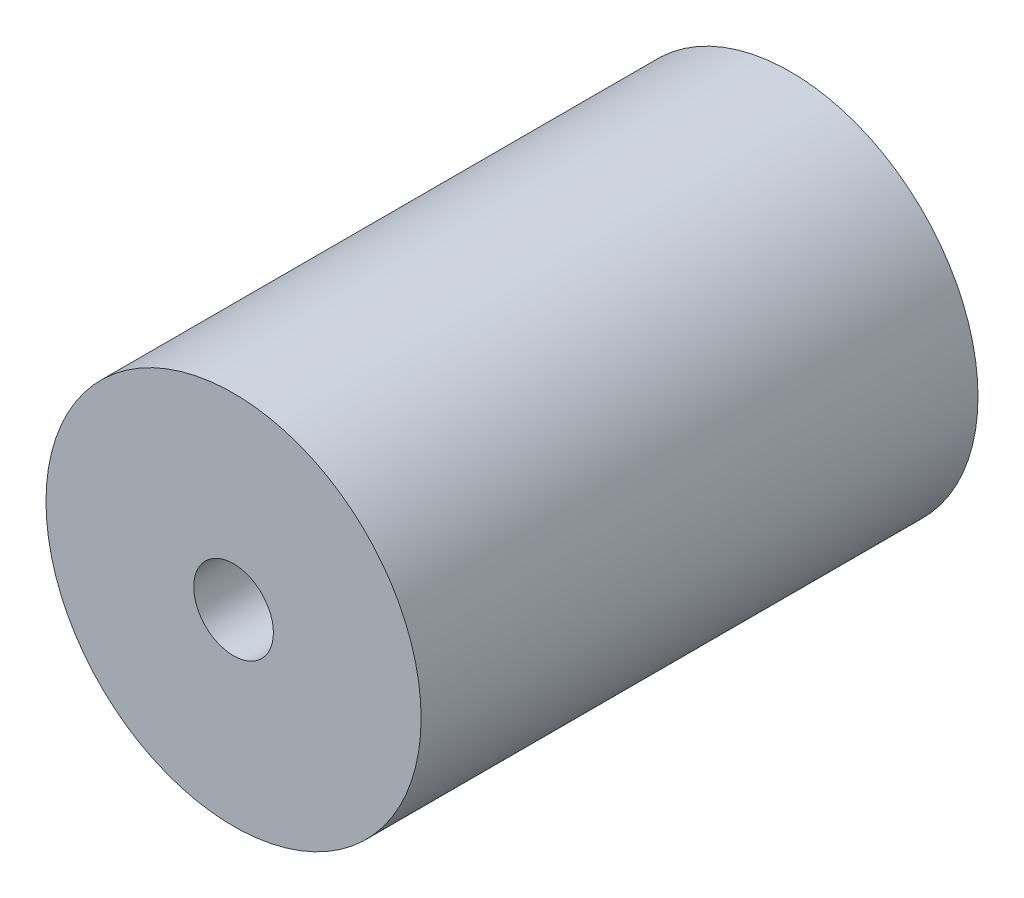
ISO-10303-21;
HEADER;
FILE_DESCRIPTION(('STEP AP214'),'2;1');
FILE_NAME('part.step','',(''),(''),'','','');
FILE_SCHEMA(('AUTOMOTIVE_DESIGN { 1 0 10303 214 1 1 1 1 }'));
ENDSEC;
DATA;
#1=APPLICATION_CONTEXT('core data for automotive mechanical design processes');
#2=APPLICATION_PROTOCOL_DEFINITION('international standard','automotive_design',2000,#1);
#3=PRODUCT_CONTEXT('',#1,'mechanical');
#4=PRODUCT('Part','Part','',(#3));
#5=PRODUCT_RELATED_PRODUCT_CATEGORY('part','',(#4));
#6=PRODUCT_DEFINITION_FORMATION('','',#4);
#7=PRODUCT_DEFINITION_CONTEXT('part definition',#1,'design');
#8=PRODUCT_DEFINITION('design','',#6,#7);
#9=PRODUCT_DEFINITION_SHAPE('','',#8);
#10=(LENGTH_UNIT() NAMED_UNIT(*) SI_UNIT(.MILLI.,.METRE.));
#11=(NAMED_UNIT(*) PLANE_ANGLE_UNIT() SI_UNIT($,.RADIAN.));
#12=(NAMED_UNIT(*) SI_UNIT($,.STERADIAN.) SOLID_ANGLE_UNIT());
#13=UNCERTAINTY_MEASURE_WITH_UNIT(LENGTH_MEASURE(1.E-05),#10,'distance_accuracy_value','');
#14=(GEOMETRIC_REPRESENTATION_CONTEXT(3) GLOBAL_UNCERTAINTY_ASSIGNED_CONTEXT((#13)) GLOBAL_UNIT_ASSIGNED_CONTEXT((#10,
#11,#12)) REPRESENTATION_CONTEXT('',''));
#15=CARTESIAN_POINT('',(0.,0.,0.));
#16=DIRECTION('',(0.,0.,1.));
#17=DIRECTION('',(1.,0.,0.));
#18=AXIS2_PLACEMENT_3D('',#15,#16,#17);
#19=CARTESIAN_POINT('',(0.,0.,29.693));
#20=DIRECTION('',(0.,0.,1.));
#21=DIRECTION('',(1.,0.,0.));
#22=AXIS2_PLACEMENT_3D('',#19,#20,#21);
#23=PLANE('',#22);
#24=CARTESIAN_POINT('',(0.,0.,29.693));
#25=DIRECTION('',(0.,0.,1.));
#26=DIRECTION('',(1.,0.,0.));
#27=AXIS2_PLACEMENT_3D('',#24,#25,#26);
#28=CIRCLE('',#27,10.);
#29=CARTESIAN_POINT('',(10.,0.,29.693));
#30=VERTEX_POINT('',#29);
#31=EDGE_CURVE('E10',#30,#30,#28,.T.);
#32=ORIENTED_EDGE('',*,*,#31,.T.);
#33=EDGE_LOOP('',(#32));
#34=FACE_BOUND('',#33,.T.);
#35=CARTESIAN_POINT('',(0.,0.,29.693));
#36=DIRECTION('',(0.,0.,1.));
#37=DIRECTION('',(1.,0.,0.));
#38=AXIS2_PLACEMENT_3D('',#35,#36,#37);
#39=CIRCLE('',#38,2.125000052);
#40=CARTESIAN_POINT('',(2.125000052,0.,29.693));
#41=VERTEX_POINT('',#40);
#42=EDGE_CURVE('E49',#41,#41,#39,.T.);
#43=ORIENTED_EDGE('',*,*,#42,.F.);
#44=EDGE_LOOP('',(#43));
#45=FACE_BOUND('',#44,.T.);
#46=ADVANCED_FACE('F39',(#34,#45),#23,.T.);
#47=CARTESIAN_POINT('',(0.,0.,0.));
#48=DIRECTION('',(0.,0.,1.));
#49=DIRECTION('',(1.,0.,0.));
#50=AXIS2_PLACEMENT_3D('',#47,#48,#49);
#51=PLANE('',#50);
#52=CARTESIAN_POINT('',(0.,0.,0.));
#53=DIRECTION('',(0.,0.,1.));
#54=DIRECTION('',(1.,0.,0.));
#55=AXIS2_PLACEMENT_3D('',#52,#53,#54);
#56=CIRCLE('',#55,10.);
#57=CARTESIAN_POINT('',(10.,0.,0.));
#58=VERTEX_POINT('',#57);
#59=EDGE_CURVE('E43',#58,#58,#56,.T.);
#60=ORIENTED_EDGE('',*,*,#59,.F.);
#61=EDGE_LOOP('',(#60));
#62=FACE_BOUND('',#61,.T.);
#63=CARTESIAN_POINT('',(0.,0.,0.));
#64=DIRECTION('',(0.,0.,1.));
#65=DIRECTION('',(1.,0.,0.));
#66=AXIS2_PLACEMENT_3D('',#63,#64,#65);
#67=CIRCLE('',#66,2.125000052);
#68=CARTESIAN_POINT('',(2.125000052,0.,0.));
#69=VERTEX_POINT('',#68);
#70=EDGE_CURVE('E55',#69,#69,#67,.T.);
#71=ORIENTED_EDGE('',*,*,#70,.T.);
#72=EDGE_LOOP('',(#71));
#73=FACE_BOUND('',#72,.T.);
#74=ADVANCED_FACE('F65',(#62,#73),#51,.F.);
#75=CARTESIAN_POINT('',(0.,0.,29.693));
#76=DIRECTION('',(0.,0.,-1.));
#77=DIRECTION('',(-1.,0.,0.));
#78=AXIS2_PLACEMENT_3D('',#75,#76,#77);
#79=CYLINDRICAL_SURFACE('',#78,10.);
#80=ORIENTED_EDGE('',*,*,#31,.F.);
#81=EDGE_LOOP('',(#80));
#82=FACE_BOUND('',#81,.T.);
#83=ORIENTED_EDGE('',*,*,#59,.T.);
#84=EDGE_LOOP('',(#83));
#85=FACE_BOUND('',#84,.T.);
#86=ADVANCED_FACE('F41',(#82,#85),#79,.T.);
#87=CARTESIAN_POINT('',(0.,0.,29.693));
#88=DIRECTION('',(0.,0.,-1.));
#89=DIRECTION('',(-1.,0.,0.));
#90=AXIS2_PLACEMENT_3D('',#87,#88,#89);
#91=CYLINDRICAL_SURFACE('',#90,2.125000052);
#92=ORIENTED_EDGE('',*,*,#42,.T.);
#93=EDGE_LOOP('',(#92));
#94=FACE_BOUND('',#93,.T.);
#95=ORIENTED_EDGE('',*,*,#70,.F.);
#96=EDGE_LOOP('',(#95));
#97=FACE_BOUND('',#96,.T.);
#98=ADVANCED_FACE('F59',(#94,#97),#91,.F.);
#99=CLOSED_SHELL('',(#46,#74,#86,#98));
#100=MANIFOLD_SOLID_BREP('B2',#99);
#101=ADVANCED_BREP_SHAPE_REPRESENTATION('',(#18,#100),#14);
#102=SHAPE_DEFINITION_REPRESENTATION(#9,#101);
ENDSEC;
END-ISO-10303-21;
